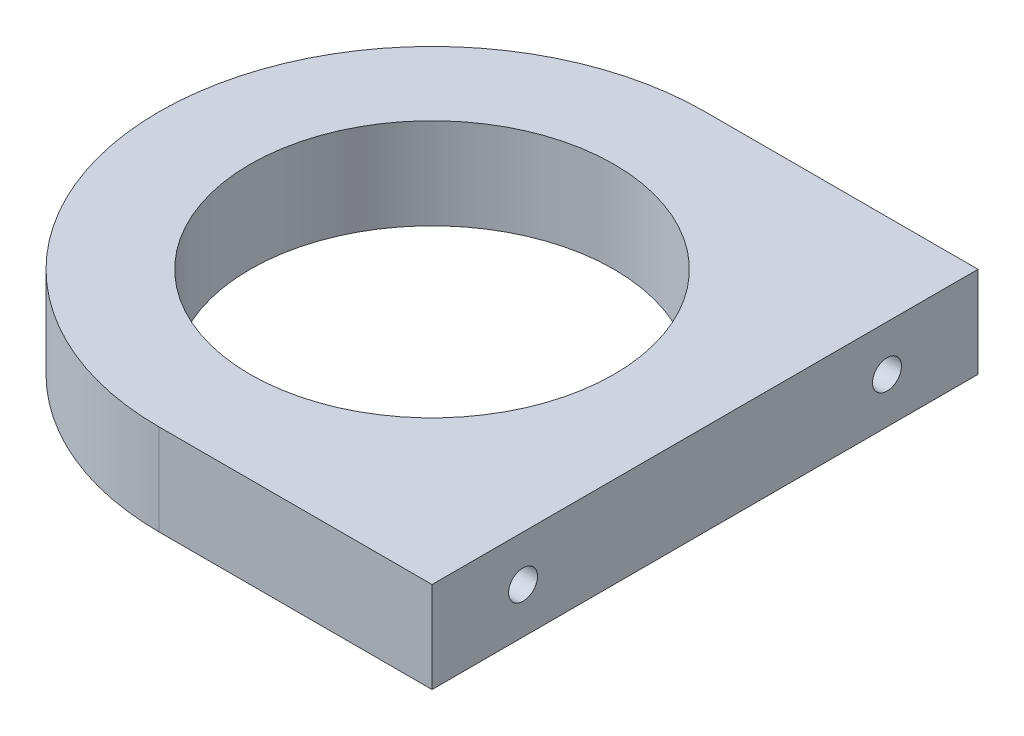
ISO-10303-21;
HEADER;
FILE_DESCRIPTION(('STEP AP214'),'2;1');
FILE_NAME('part.step','',(''),(''),'','','');
FILE_SCHEMA(('AUTOMOTIVE_DESIGN { 1 0 10303 214 1 1 1 1 }'));
ENDSEC;
DATA;
#1=APPLICATION_CONTEXT('core data for automotive mechanical design processes');
#2=APPLICATION_PROTOCOL_DEFINITION('international standard','automotive_design',2000,#1);
#3=PRODUCT_CONTEXT('',#1,'mechanical');
#4=PRODUCT('Part','Part','',(#3));
#5=PRODUCT_RELATED_PRODUCT_CATEGORY('part','',(#4));
#6=PRODUCT_DEFINITION_FORMATION('','',#4);
#7=PRODUCT_DEFINITION_CONTEXT('part definition',#1,'design');
#8=PRODUCT_DEFINITION('design','',#6,#7);
#9=PRODUCT_DEFINITION_SHAPE('','',#8);
#10=(LENGTH_UNIT() NAMED_UNIT(*) SI_UNIT(.MILLI.,.METRE.));
#11=(NAMED_UNIT(*) PLANE_ANGLE_UNIT() SI_UNIT($,.RADIAN.));
#12=(NAMED_UNIT(*) SI_UNIT($,.STERADIAN.) SOLID_ANGLE_UNIT());
#13=UNCERTAINTY_MEASURE_WITH_UNIT(LENGTH_MEASURE(1.E-05),#10,'distance_accuracy_value','');
#14=(GEOMETRIC_REPRESENTATION_CONTEXT(3) GLOBAL_UNCERTAINTY_ASSIGNED_CONTEXT((#13)) GLOBAL_UNIT_ASSIGNED_CONTEXT((#10,
#11,#12)) REPRESENTATION_CONTEXT('',''));
#15=CARTESIAN_POINT('',(0.,0.,0.));
#16=DIRECTION('',(0.,0.,1.));
#17=DIRECTION('',(1.,0.,0.));
#18=AXIS2_PLACEMENT_3D('',#15,#16,#17);
#19=CARTESIAN_POINT('',(38.1,12.7,38.1));
#20=DIRECTION('',(-1.,0.,0.));
#21=DIRECTION('',(0.,0.,1.));
#22=AXIS2_PLACEMENT_3D('',#19,#20,#21);
#23=PLANE('',#22);
#24=CARTESIAN_POINT('',(38.1,6.35,25.4));
#25=DIRECTION('',(1.,0.,0.));
#26=DIRECTION('',(0.,0.,-1.));
#27=AXIS2_PLACEMENT_3D('',#24,#25,#26);
#28=CIRCLE('',#27,2.01929999999999);
#29=CARTESIAN_POINT('',(38.1,6.35,23.3807));
#30=VERTEX_POINT('',#29);
#31=EDGE_CURVE('E95',#30,#30,#28,.T.);
#32=ORIENTED_EDGE('',*,*,#31,.F.);
#33=EDGE_LOOP('',(#32));
#34=FACE_BOUND('',#33,.T.);
#35=CARTESIAN_POINT('',(38.1,6.35,-25.4));
#36=DIRECTION('',(1.,0.,0.));
#37=DIRECTION('',(0.,0.,-1.));
#38=AXIS2_PLACEMENT_3D('',#35,#36,#37);
#39=CIRCLE('',#38,2.01929999999999);
#40=CARTESIAN_POINT('',(38.1,6.35,-27.4193));
#41=VERTEX_POINT('',#40);
#42=EDGE_CURVE('E94',#41,#41,#39,.T.);
#43=ORIENTED_EDGE('',*,*,#42,.F.);
#44=EDGE_LOOP('',(#43));
#45=FACE_BOUND('',#44,.T.);
#46=DIRECTION('',(0.,0.,-1.));
#47=VECTOR('',#46,1.);
#48=CARTESIAN_POINT('',(38.1,0.,38.1));
#49=LINE('',#48,#47);
#50=CARTESIAN_POINT('',(38.1,0.,38.1));
#51=VERTEX_POINT('',#50);
#52=CARTESIAN_POINT('',(38.1,0.,-38.1));
#53=VERTEX_POINT('',#52);
#54=EDGE_CURVE('E107',#51,#53,#49,.T.);
#55=ORIENTED_EDGE('',*,*,#54,.T.);
#56=DIRECTION('',(0.,-1.,0.));
#57=VECTOR('',#56,1.);
#58=CARTESIAN_POINT('',(38.1,12.7,-38.1));
#59=LINE('',#58,#57);
#60=CARTESIAN_POINT('',(38.1,12.7,-38.1));
#61=VERTEX_POINT('',#60);
#62=EDGE_CURVE('E125',#61,#53,#59,.T.);
#63=ORIENTED_EDGE('',*,*,#62,.F.);
#64=DIRECTION('',(0.,0.,-1.));
#65=VECTOR('',#64,1.);
#66=CARTESIAN_POINT('',(38.1,12.7,38.1));
#67=LINE('',#66,#65);
#68=CARTESIAN_POINT('',(38.1,12.7,38.1));
#69=VERTEX_POINT('',#68);
#70=EDGE_CURVE('E108',#69,#61,#67,.T.);
#71=ORIENTED_EDGE('',*,*,#70,.F.);
#72=DIRECTION('',(0.,-1.,0.));
#73=VECTOR('',#72,1.);
#74=CARTESIAN_POINT('',(38.1,12.7,38.1));
#75=LINE('',#74,#73);
#76=EDGE_CURVE('E116',#69,#51,#75,.T.);
#77=ORIENTED_EDGE('',*,*,#76,.T.);
#78=EDGE_LOOP('',(#55,#63,#71,#77));
#79=FACE_BOUND('',#78,.T.);
#80=ADVANCED_FACE('F36',(#34,#45,#79),#23,.F.);
#81=CARTESIAN_POINT('',(-38.1,12.7,-38.1));
#82=DIRECTION('',(0.,0.,1.));
#83=DIRECTION('',(1.,0.,0.));
#84=AXIS2_PLACEMENT_3D('',#81,#82,#83);
#85=PLANE('',#84);
#86=DIRECTION('',(-1.,0.,0.));
#87=VECTOR('',#86,1.);
#88=CARTESIAN_POINT('',(-38.1,0.,-38.1));
#89=LINE('',#88,#87);
#90=CARTESIAN_POINT('',(0.,0.,-38.1));
#91=VERTEX_POINT('',#90);
#92=EDGE_CURVE('E119',#53,#91,#89,.T.);
#93=ORIENTED_EDGE('',*,*,#92,.T.);
#94=DIRECTION('',(0.,-1.,0.));
#95=VECTOR('',#94,1.);
#96=CARTESIAN_POINT('',(0.,12.7,-38.1));
#97=LINE('',#96,#95);
#98=CARTESIAN_POINT('',(0.,12.7,-38.1));
#99=VERTEX_POINT('',#98);
#100=EDGE_CURVE('E132',#91,#99,#97,.F.);
#101=ORIENTED_EDGE('',*,*,#100,.T.);
#102=DIRECTION('',(-1.,0.,0.));
#103=VECTOR('',#102,1.);
#104=CARTESIAN_POINT('',(-38.1,12.7,-38.1));
#105=LINE('',#104,#103);
#106=EDGE_CURVE('E111',#61,#99,#105,.T.);
#107=ORIENTED_EDGE('',*,*,#106,.F.);
#108=ORIENTED_EDGE('',*,*,#62,.T.);
#109=EDGE_LOOP('',(#93,#101,#107,#108));
#110=FACE_BOUND('',#109,.T.);
#111=ADVANCED_FACE('F138',(#110),#85,.F.);
#112=CARTESIAN_POINT('',(-38.1,12.7,38.1));
#113=DIRECTION('',(0.,0.,-1.));
#114=DIRECTION('',(-1.,0.,0.));
#115=AXIS2_PLACEMENT_3D('',#112,#113,#114);
#116=PLANE('',#115);
#117=DIRECTION('',(1.,0.,0.));
#118=VECTOR('',#117,1.);
#119=CARTESIAN_POINT('',(-38.1,12.7,38.1));
#120=LINE('',#119,#118);
#121=CARTESIAN_POINT('',(0.,12.7,38.1));
#122=VERTEX_POINT('',#121);
#123=EDGE_CURVE('E114',#122,#69,#120,.T.);
#124=ORIENTED_EDGE('',*,*,#123,.F.);
#125=DIRECTION('',(0.,-1.,0.));
#126=VECTOR('',#125,1.);
#127=CARTESIAN_POINT('',(0.,12.7,38.1));
#128=LINE('',#127,#126);
#129=CARTESIAN_POINT('',(0.,0.,38.1));
#130=VERTEX_POINT('',#129);
#131=EDGE_CURVE('E11',#122,#130,#128,.T.);
#132=ORIENTED_EDGE('',*,*,#131,.T.);
#133=DIRECTION('',(1.,0.,0.));
#134=VECTOR('',#133,1.);
#135=CARTESIAN_POINT('',(-38.1,0.,38.1));
#136=LINE('',#135,#134);
#137=EDGE_CURVE('E112',#130,#51,#136,.T.);
#138=ORIENTED_EDGE('',*,*,#137,.T.);
#139=ORIENTED_EDGE('',*,*,#76,.F.);
#140=EDGE_LOOP('',(#124,#132,#138,#139));
#141=FACE_BOUND('',#140,.T.);
#142=ADVANCED_FACE('F179',(#141),#116,.F.);
#143=CARTESIAN_POINT('',(0.,12.7,0.));
#144=DIRECTION('',(0.,-1.,0.));
#145=DIRECTION('',(0.,0.,-1.));
#146=AXIS2_PLACEMENT_3D('',#143,#144,#145);
#147=PLANE('',#146);
#148=CARTESIAN_POINT('',(0.,12.7,0.));
#149=DIRECTION('',(0.,1.,0.));
#150=DIRECTION('',(0.,0.,1.));
#151=AXIS2_PLACEMENT_3D('',#148,#149,#150);
#152=CIRCLE('',#151,25.4);
#153=CARTESIAN_POINT('',(0.,12.7,25.4));
#154=VERTEX_POINT('',#153);
#155=EDGE_CURVE('E155',#154,#154,#152,.T.);
#156=ORIENTED_EDGE('',*,*,#155,.F.);
#157=EDGE_LOOP('',(#156));
#158=FACE_BOUND('',#157,.T.);
#159=ORIENTED_EDGE('',*,*,#106,.T.);
#160=CARTESIAN_POINT('',(0.,12.7,0.));
#161=DIRECTION('',(0.,-1.,0.));
#162=DIRECTION('',(0.,0.,-1.));
#163=AXIS2_PLACEMENT_3D('',#160,#161,#162);
#164=CIRCLE('',#163,38.1);
#165=CARTESIAN_POINT('',(-38.1,12.7,0.));
#166=VERTEX_POINT('',#165);
#167=EDGE_CURVE('E45',#99,#166,#164,.F.);
#168=ORIENTED_EDGE('',*,*,#167,.T.);
#169=CARTESIAN_POINT('',(0.,12.7,0.));
#170=DIRECTION('',(0.,-1.,0.));
#171=DIRECTION('',(0.,0.,-1.));
#172=AXIS2_PLACEMENT_3D('',#169,#170,#171);
#173=CIRCLE('',#172,38.1);
#174=EDGE_CURVE('E52',#166,#122,#173,.F.);
#175=ORIENTED_EDGE('',*,*,#174,.T.);
#176=ORIENTED_EDGE('',*,*,#123,.T.);
#177=ORIENTED_EDGE('',*,*,#70,.T.);
#178=EDGE_LOOP('',(#159,#168,#175,#176,#177));
#179=FACE_BOUND('',#178,.T.);
#180=ADVANCED_FACE('F141',(#158,#179),#147,.F.);
#181=CARTESIAN_POINT('',(0.,0.,0.));
#182=DIRECTION('',(0.,-1.,0.));
#183=DIRECTION('',(0.,0.,-1.));
#184=AXIS2_PLACEMENT_3D('',#181,#182,#183);
#185=PLANE('',#184);
#186=CARTESIAN_POINT('',(0.,0.,0.));
#187=DIRECTION('',(0.,1.,0.));
#188=DIRECTION('',(0.,0.,1.));
#189=AXIS2_PLACEMENT_3D('',#186,#187,#188);
#190=CIRCLE('',#189,25.4);
#191=CARTESIAN_POINT('',(0.,0.,25.4));
#192=VERTEX_POINT('',#191);
#193=EDGE_CURVE('E101',#192,#192,#190,.T.);
#194=ORIENTED_EDGE('',*,*,#193,.T.);
#195=EDGE_LOOP('',(#194));
#196=FACE_BOUND('',#195,.T.);
#197=CARTESIAN_POINT('',(0.,0.,0.));
#198=DIRECTION('',(0.,-1.,0.));
#199=DIRECTION('',(0.,0.,-1.));
#200=AXIS2_PLACEMENT_3D('',#197,#198,#199);
#201=CIRCLE('',#200,38.1);
#202=CARTESIAN_POINT('',(-38.1,0.,0.));
#203=VERTEX_POINT('',#202);
#204=EDGE_CURVE('E128',#130,#203,#201,.T.);
#205=ORIENTED_EDGE('',*,*,#204,.T.);
#206=CARTESIAN_POINT('',(0.,0.,0.));
#207=DIRECTION('',(0.,-1.,0.));
#208=DIRECTION('',(0.,0.,-1.));
#209=AXIS2_PLACEMENT_3D('',#206,#207,#208);
#210=CIRCLE('',#209,38.1);
#211=EDGE_CURVE('E130',#203,#91,#210,.T.);
#212=ORIENTED_EDGE('',*,*,#211,.T.);
#213=ORIENTED_EDGE('',*,*,#92,.F.);
#214=ORIENTED_EDGE('',*,*,#54,.F.);
#215=ORIENTED_EDGE('',*,*,#137,.F.);
#216=EDGE_LOOP('',(#205,#212,#213,#214,#215));
#217=FACE_BOUND('',#216,.T.);
#218=ADVANCED_FACE('F149',(#196,#217),#185,.T.);
#219=CARTESIAN_POINT('',(28.448,6.35,-25.4));
#220=DIRECTION('',(1.,0.,0.));
#221=DIRECTION('',(0.,0.,-1.));
#222=AXIS2_PLACEMENT_3D('',#219,#220,#221);
#223=CONICAL_SURFACE('',#222,2.0193,1.02974425867666);
#224=CARTESIAN_POINT('',(27.2346821519977,6.35,-25.4));
#225=VERTEX_POINT('',#224);
#226=VERTEX_LOOP('',#225);
#227=FACE_BOUND('',#226,.T.);
#228=CARTESIAN_POINT('',(28.448,6.35,-25.4));
#229=DIRECTION('',(1.,0.,0.));
#230=DIRECTION('',(0.,0.,-1.));
#231=AXIS2_PLACEMENT_3D('',#228,#229,#230);
#232=CIRCLE('',#231,2.0193);
#233=CARTESIAN_POINT('',(28.448,6.35,-27.4193));
#234=VERTEX_POINT('',#233);
#235=EDGE_CURVE('E98',#234,#234,#232,.T.);
#236=ORIENTED_EDGE('',*,*,#235,.T.);
#237=EDGE_LOOP('',(#236));
#238=FACE_BOUND('',#237,.T.);
#239=ADVANCED_FACE('F200',(#227,#238),#223,.F.);
#240=CARTESIAN_POINT('',(38.1,6.35,-25.4));
#241=DIRECTION('',(1.,0.,0.));
#242=DIRECTION('',(0.,0.,-1.));
#243=AXIS2_PLACEMENT_3D('',#240,#241,#242);
#244=CYLINDRICAL_SURFACE('',#243,2.01929999999999);
#245=ORIENTED_EDGE('',*,*,#235,.F.);
#246=EDGE_LOOP('',(#245));
#247=FACE_BOUND('',#246,.T.);
#248=ORIENTED_EDGE('',*,*,#42,.T.);
#249=EDGE_LOOP('',(#248));
#250=FACE_BOUND('',#249,.T.);
#251=ADVANCED_FACE('F88',(#247,#250),#244,.F.);
#252=CARTESIAN_POINT('',(28.448,6.35,25.4));
#253=DIRECTION('',(1.,0.,0.));
#254=DIRECTION('',(0.,0.,-1.));
#255=AXIS2_PLACEMENT_3D('',#252,#253,#254);
#256=CONICAL_SURFACE('',#255,2.0193,1.02974425867666);
#257=CARTESIAN_POINT('',(27.2346821519977,6.35,25.4));
#258=VERTEX_POINT('',#257);
#259=VERTEX_LOOP('',#258);
#260=FACE_BOUND('',#259,.T.);
#261=CARTESIAN_POINT('',(28.448,6.35,25.4));
#262=DIRECTION('',(1.,0.,0.));
#263=DIRECTION('',(0.,0.,-1.));
#264=AXIS2_PLACEMENT_3D('',#261,#262,#263);
#265=CIRCLE('',#264,2.0193);
#266=CARTESIAN_POINT('',(28.448,6.35,23.3807));
#267=VERTEX_POINT('',#266);
#268=EDGE_CURVE('E92',#267,#267,#265,.T.);
#269=ORIENTED_EDGE('',*,*,#268,.T.);
#270=EDGE_LOOP('',(#269));
#271=FACE_BOUND('',#270,.T.);
#272=ADVANCED_FACE('F84',(#260,#271),#256,.F.);
#273=CARTESIAN_POINT('',(38.1,6.35,25.4));
#274=DIRECTION('',(1.,0.,0.));
#275=DIRECTION('',(0.,0.,-1.));
#276=AXIS2_PLACEMENT_3D('',#273,#274,#275);
#277=CYLINDRICAL_SURFACE('',#276,2.01929999999999);
#278=ORIENTED_EDGE('',*,*,#268,.F.);
#279=EDGE_LOOP('',(#278));
#280=FACE_BOUND('',#279,.T.);
#281=ORIENTED_EDGE('',*,*,#31,.T.);
#282=EDGE_LOOP('',(#281));
#283=FACE_BOUND('',#282,.T.);
#284=ADVANCED_FACE('F87',(#280,#283),#277,.F.);
#285=CARTESIAN_POINT('',(0.,0.,0.));
#286=DIRECTION('',(0.,1.,0.));
#287=DIRECTION('',(0.,0.,1.));
#288=AXIS2_PLACEMENT_3D('',#285,#286,#287);
#289=CYLINDRICAL_SURFACE('',#288,25.4);
#290=ORIENTED_EDGE('',*,*,#193,.F.);
#291=EDGE_LOOP('',(#290));
#292=FACE_BOUND('',#291,.T.);
#293=ORIENTED_EDGE('',*,*,#155,.T.);
#294=EDGE_LOOP('',(#293));
#295=FACE_BOUND('',#294,.T.);
#296=ADVANCED_FACE('F164',(#292,#295),#289,.F.);
#297=CARTESIAN_POINT('',(0.,12.7,0.));
#298=DIRECTION('',(0.,-1.,0.));
#299=DIRECTION('',(0.,0.,-1.));
#300=AXIS2_PLACEMENT_3D('',#297,#298,#299);
#301=CYLINDRICAL_SURFACE('',#300,38.1);
#302=ORIENTED_EDGE('',*,*,#131,.F.);
#303=ORIENTED_EDGE('',*,*,#174,.F.);
#304=DIRECTION('',(0.,-1.,0.));
#305=VECTOR('',#304,1.);
#306=CARTESIAN_POINT('',(-38.1,12.7,0.));
#307=LINE('',#306,#305);
#308=EDGE_CURVE('E40',#203,#166,#307,.F.);
#309=ORIENTED_EDGE('',*,*,#308,.F.);
#310=ORIENTED_EDGE('',*,*,#204,.F.);
#311=EDGE_LOOP('',(#302,#303,#309,#310));
#312=FACE_BOUND('',#311,.T.);
#313=ADVANCED_FACE('F38',(#312),#301,.T.);
#314=CARTESIAN_POINT('',(0.,12.7,0.));
#315=DIRECTION('',(0.,-1.,0.));
#316=DIRECTION('',(0.,0.,-1.));
#317=AXIS2_PLACEMENT_3D('',#314,#315,#316);
#318=CYLINDRICAL_SURFACE('',#317,38.1);
#319=ORIENTED_EDGE('',*,*,#167,.F.);
#320=ORIENTED_EDGE('',*,*,#100,.F.);
#321=ORIENTED_EDGE('',*,*,#211,.F.);
#322=ORIENTED_EDGE('',*,*,#308,.T.);
#323=EDGE_LOOP('',(#319,#320,#321,#322));
#324=FACE_BOUND('',#323,.T.);
#325=ADVANCED_FACE('F153',(#324),#318,.T.);
#326=CLOSED_SHELL('',(#80,#111,#142,#180,#218,#239,#251,#272,#284,#296,#313,#325));
#327=MANIFOLD_SOLID_BREP('B2',#326);
#328=ADVANCED_BREP_SHAPE_REPRESENTATION('',(#18,#327),#14);
#329=SHAPE_DEFINITION_REPRESENTATION(#9,#328);
ENDSEC;
END-ISO-10303-21;
